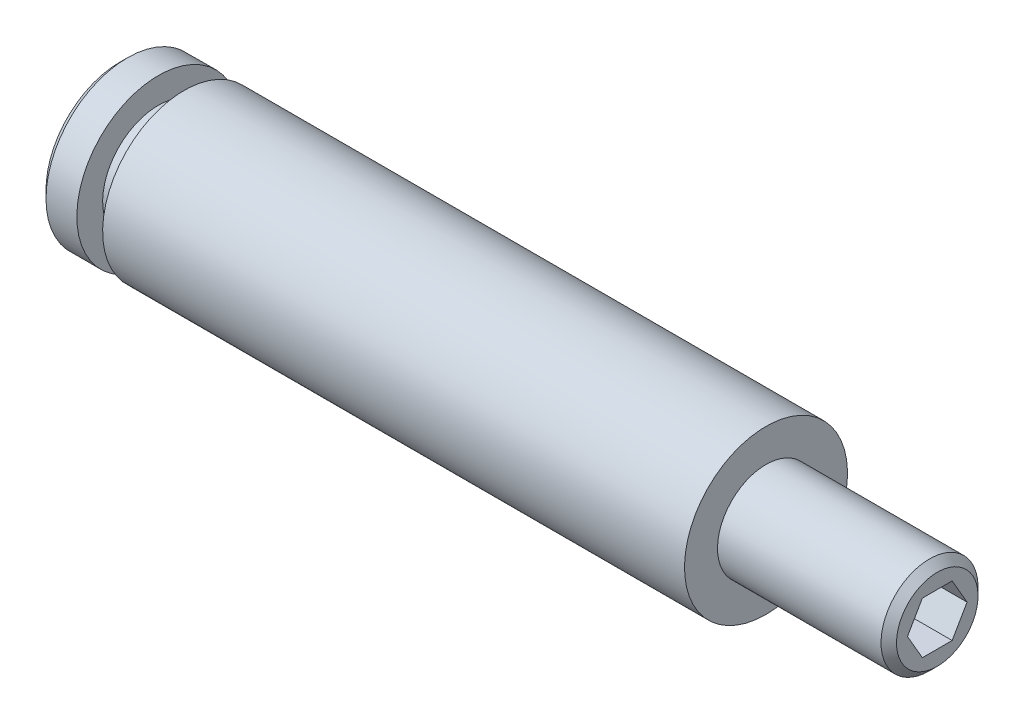
ISO-10303-21;
HEADER;
FILE_DESCRIPTION(('STEP AP214'),'2;1');
FILE_NAME('part.step','',(''),(''),'','','');
FILE_SCHEMA(('AUTOMOTIVE_DESIGN { 1 0 10303 214 1 1 1 1 }'));
ENDSEC;
DATA;
#1=APPLICATION_CONTEXT('core data for automotive mechanical design processes');
#2=APPLICATION_PROTOCOL_DEFINITION('international standard','automotive_design',2000,#1);
#3=PRODUCT_CONTEXT('',#1,'mechanical');
#4=PRODUCT('Part','Part','',(#3));
#5=PRODUCT_RELATED_PRODUCT_CATEGORY('part','',(#4));
#6=PRODUCT_DEFINITION_FORMATION('','',#4);
#7=PRODUCT_DEFINITION_CONTEXT('part definition',#1,'design');
#8=PRODUCT_DEFINITION('design','',#6,#7);
#9=PRODUCT_DEFINITION_SHAPE('','',#8);
#10=(LENGTH_UNIT() NAMED_UNIT(*) SI_UNIT(.MILLI.,.METRE.));
#11=(NAMED_UNIT(*) PLANE_ANGLE_UNIT() SI_UNIT($,.RADIAN.));
#12=(NAMED_UNIT(*) SI_UNIT($,.STERADIAN.) SOLID_ANGLE_UNIT());
#13=UNCERTAINTY_MEASURE_WITH_UNIT(LENGTH_MEASURE(1.E-05),#10,'distance_accuracy_value','');
#14=(GEOMETRIC_REPRESENTATION_CONTEXT(3) GLOBAL_UNCERTAINTY_ASSIGNED_CONTEXT((#13)) GLOBAL_UNIT_ASSIGNED_CONTEXT((#10,
#11,#12)) REPRESENTATION_CONTEXT('',''));
#15=CARTESIAN_POINT('',(0.,0.,0.));
#16=DIRECTION('',(0.,0.,1.));
#17=DIRECTION('',(1.,0.,0.));
#18=AXIS2_PLACEMENT_3D('',#15,#16,#17);
#19=CARTESIAN_POINT('',(0.,10.033,0.));
#20=DIRECTION('',(1.,0.,0.));
#21=DIRECTION('',(0.,1.,0.));
#22=AXIS2_PLACEMENT_3D('',#19,#20,#21);
#23=PLANE('',#22);
#24=CARTESIAN_POINT('',(0.,0.,0.));
#25=DIRECTION('',(1.,0.,0.));
#26=DIRECTION('',(0.,1.,0.));
#27=AXIS2_PLACEMENT_3D('',#24,#25,#26);
#28=CIRCLE('',#27,9.08050000000002);
#29=CARTESIAN_POINT('',(0.,9.08050000000002,0.));
#30=VERTEX_POINT('',#29);
#31=EDGE_CURVE('E194',#30,#30,#28,.F.);
#32=ORIENTED_EDGE('',*,*,#31,.T.);
#33=EDGE_LOOP('',(#32));
#34=FACE_BOUND('',#33,.T.);
#35=ADVANCED_FACE('F45',(#34),#23,.F.);
#36=CARTESIAN_POINT('',(100.6348,0.,0.));
#37=DIRECTION('',(-1.,0.,0.));
#38=DIRECTION('',(0.,-1.,0.));
#39=AXIS2_PLACEMENT_3D('',#36,#37,#38);
#40=PLANE('',#39);
#41=CARTESIAN_POINT('',(100.6348,0.,0.));
#42=DIRECTION('',(-1.,0.,0.));
#43=DIRECTION('',(0.,-1.,0.));
#44=AXIS2_PLACEMENT_3D('',#41,#42,#43);
#45=CIRCLE('',#44,5.01650000000002);
#46=CARTESIAN_POINT('',(100.6348,-5.01650000000003,0.));
#47=VERTEX_POINT('',#46);
#48=EDGE_CURVE('E11',#47,#47,#45,.F.);
#49=ORIENTED_EDGE('',*,*,#48,.T.);
#50=EDGE_LOOP('',(#49));
#51=FACE_BOUND('',#50,.T.);
#52=DIRECTION('',(0.,0.866025403784438,0.5));
#53=VECTOR('',#52,1.);
#54=CARTESIAN_POINT('',(100.6348,0.,-3.66617420935412));
#55=LINE('',#54,#53);
#56=CARTESIAN_POINT('',(100.6348,0.,-3.66617420935412));
#57=VERTEX_POINT('',#56);
#58=CARTESIAN_POINT('',(100.6348,3.175,-1.83308710467706));
#59=VERTEX_POINT('',#58);
#60=EDGE_CURVE('E142',#57,#59,#55,.T.);
#61=ORIENTED_EDGE('',*,*,#60,.F.);
#62=DIRECTION('',(0.,0.866025403784439,-0.5));
#63=VECTOR('',#62,1.);
#64=CARTESIAN_POINT('',(100.6348,-3.175,-1.83308710467706));
#65=LINE('',#64,#63);
#66=CARTESIAN_POINT('',(100.6348,-3.175,-1.83308710467706));
#67=VERTEX_POINT('',#66);
#68=EDGE_CURVE('E62',#67,#57,#65,.T.);
#69=ORIENTED_EDGE('',*,*,#68,.F.);
#70=DIRECTION('',(0.,0.,-1.));
#71=VECTOR('',#70,1.);
#72=CARTESIAN_POINT('',(100.6348,-3.175,1.83308710467706));
#73=LINE('',#72,#71);
#74=CARTESIAN_POINT('',(100.6348,-3.175,1.83308710467706));
#75=VERTEX_POINT('',#74);
#76=EDGE_CURVE('E155',#75,#67,#73,.T.);
#77=ORIENTED_EDGE('',*,*,#76,.F.);
#78=DIRECTION('',(0.,-0.866025403784438,-0.5));
#79=VECTOR('',#78,1.);
#80=CARTESIAN_POINT('',(100.6348,0.,3.66617420935412));
#81=LINE('',#80,#79);
#82=CARTESIAN_POINT('',(100.6348,0.,3.66617420935412));
#83=VERTEX_POINT('',#82);
#84=EDGE_CURVE('E152',#83,#75,#81,.T.);
#85=ORIENTED_EDGE('',*,*,#84,.F.);
#86=DIRECTION('',(0.,-0.866025403784438,0.5));
#87=VECTOR('',#86,1.);
#88=CARTESIAN_POINT('',(100.6348,3.175,1.83308710467706));
#89=LINE('',#88,#87);
#90=CARTESIAN_POINT('',(100.6348,3.175,1.83308710467706));
#91=VERTEX_POINT('',#90);
#92=EDGE_CURVE('E110',#91,#83,#89,.T.);
#93=ORIENTED_EDGE('',*,*,#92,.F.);
#94=DIRECTION('',(0.,0.,1.));
#95=VECTOR('',#94,1.);
#96=CARTESIAN_POINT('',(100.6348,3.175,-1.83308710467706));
#97=LINE('',#96,#95);
#98=EDGE_CURVE('E146',#59,#91,#97,.T.);
#99=ORIENTED_EDGE('',*,*,#98,.F.);
#100=EDGE_LOOP('',(#61,#69,#77,#85,#93,#99));
#101=FACE_BOUND('',#100,.T.);
#102=ADVANCED_FACE('F217',(#51,#101),#40,.F.);
#103=CARTESIAN_POINT('',(0.,0.,0.));
#104=DIRECTION('',(-1.,0.,0.));
#105=DIRECTION('',(0.,-1.,0.));
#106=AXIS2_PLACEMENT_3D('',#103,#104,#105);
#107=CYLINDRICAL_SURFACE('',#106,5.969);
#108=CARTESIAN_POINT('',(99.6823,0.,0.));
#109=DIRECTION('',(-1.,0.,0.));
#110=DIRECTION('',(0.,-1.,0.));
#111=AXIS2_PLACEMENT_3D('',#108,#109,#110);
#112=CIRCLE('',#111,5.969);
#113=CARTESIAN_POINT('',(99.6823,-5.96900000000001,0.));
#114=VERTEX_POINT('',#113);
#115=EDGE_CURVE('E55',#114,#114,#112,.T.);
#116=ORIENTED_EDGE('',*,*,#115,.T.);
#117=EDGE_LOOP('',(#116));
#118=FACE_BOUND('',#117,.T.);
#119=CARTESIAN_POINT('',(79.5528,0.,0.));
#120=DIRECTION('',(-1.,0.,0.));
#121=DIRECTION('',(0.,-1.,0.));
#122=AXIS2_PLACEMENT_3D('',#119,#120,#121);
#123=CIRCLE('',#122,5.969);
#124=CARTESIAN_POINT('',(79.5528,-5.969,0.));
#125=VERTEX_POINT('',#124);
#126=EDGE_CURVE('E190',#125,#125,#123,.T.);
#127=ORIENTED_EDGE('',*,*,#126,.F.);
#128=EDGE_LOOP('',(#127));
#129=FACE_BOUND('',#128,.T.);
#130=ADVANCED_FACE('F205',(#118,#129),#107,.T.);
#131=CARTESIAN_POINT('',(79.5528,5.969,0.));
#132=DIRECTION('',(-1.,0.,0.));
#133=DIRECTION('',(0.,-1.,0.));
#134=AXIS2_PLACEMENT_3D('',#131,#132,#133);
#135=PLANE('',#134);
#136=CARTESIAN_POINT('',(79.5528,0.,0.));
#137=DIRECTION('',(-1.,0.,0.));
#138=DIRECTION('',(0.,-1.,0.));
#139=AXIS2_PLACEMENT_3D('',#136,#137,#138);
#140=CIRCLE('',#139,10.033);
#141=CARTESIAN_POINT('',(79.5528,-10.033,0.));
#142=VERTEX_POINT('',#141);
#143=EDGE_CURVE('E186',#142,#142,#140,.T.);
#144=ORIENTED_EDGE('',*,*,#143,.F.);
#145=EDGE_LOOP('',(#144));
#146=FACE_BOUND('',#145,.T.);
#147=ORIENTED_EDGE('',*,*,#126,.T.);
#148=EDGE_LOOP('',(#147));
#149=FACE_BOUND('',#148,.T.);
#150=ADVANCED_FACE('F233',(#146,#149),#135,.F.);
#151=CARTESIAN_POINT('',(0.,0.,0.));
#152=DIRECTION('',(-1.,0.,0.));
#153=DIRECTION('',(0.,-1.,0.));
#154=AXIS2_PLACEMENT_3D('',#151,#152,#153);
#155=CYLINDRICAL_SURFACE('',#154,10.033);
#156=CARTESIAN_POINT('',(7.9248,0.,0.));
#157=DIRECTION('',(-1.,0.,0.));
#158=DIRECTION('',(0.,-1.,0.));
#159=AXIS2_PLACEMENT_3D('',#156,#157,#158);
#160=CIRCLE('',#159,10.033);
#161=CARTESIAN_POINT('',(7.9248,-10.033,0.));
#162=VERTEX_POINT('',#161);
#163=EDGE_CURVE('E182',#162,#162,#160,.T.);
#164=ORIENTED_EDGE('',*,*,#163,.F.);
#165=EDGE_LOOP('',(#164));
#166=FACE_BOUND('',#165,.T.);
#167=ORIENTED_EDGE('',*,*,#143,.T.);
#168=EDGE_LOOP('',(#167));
#169=FACE_BOUND('',#168,.T.);
#170=ADVANCED_FACE('F236',(#166,#169),#155,.T.);
#171=CARTESIAN_POINT('',(7.9248,10.033,0.));
#172=DIRECTION('',(1.,0.,0.));
#173=DIRECTION('',(0.,1.,0.));
#174=AXIS2_PLACEMENT_3D('',#171,#172,#173);
#175=PLANE('',#174);
#176=CARTESIAN_POINT('',(7.9248,0.,0.));
#177=DIRECTION('',(-1.,0.,0.));
#178=DIRECTION('',(0.,-1.,0.));
#179=AXIS2_PLACEMENT_3D('',#176,#177,#178);
#180=CIRCLE('',#179,6.85799999999999);
#181=CARTESIAN_POINT('',(7.9248,-6.85799999999999,0.));
#182=VERTEX_POINT('',#181);
#183=EDGE_CURVE('E178',#182,#182,#180,.T.);
#184=ORIENTED_EDGE('',*,*,#183,.F.);
#185=EDGE_LOOP('',(#184));
#186=FACE_BOUND('',#185,.T.);
#187=ORIENTED_EDGE('',*,*,#163,.T.);
#188=EDGE_LOOP('',(#187));
#189=FACE_BOUND('',#188,.T.);
#190=ADVANCED_FACE('F240',(#186,#189),#175,.F.);
#191=CARTESIAN_POINT('',(0.,0.,0.));
#192=DIRECTION('',(-1.,0.,0.));
#193=DIRECTION('',(0.,-1.,0.));
#194=AXIS2_PLACEMENT_3D('',#191,#192,#193);
#195=CYLINDRICAL_SURFACE('',#194,6.85799999999999);
#196=CARTESIAN_POINT('',(4.7498,0.,0.));
#197=DIRECTION('',(-1.,0.,0.));
#198=DIRECTION('',(0.,-1.,0.));
#199=AXIS2_PLACEMENT_3D('',#196,#197,#198);
#200=CIRCLE('',#199,6.85799999999999);
#201=CARTESIAN_POINT('',(4.7498,-6.85799999999999,0.));
#202=VERTEX_POINT('',#201);
#203=EDGE_CURVE('E174',#202,#202,#200,.T.);
#204=ORIENTED_EDGE('',*,*,#203,.F.);
#205=EDGE_LOOP('',(#204));
#206=FACE_BOUND('',#205,.T.);
#207=ORIENTED_EDGE('',*,*,#183,.T.);
#208=EDGE_LOOP('',(#207));
#209=FACE_BOUND('',#208,.T.);
#210=ADVANCED_FACE('F244',(#206,#209),#195,.T.);
#211=CARTESIAN_POINT('',(4.7498,6.85799999999999,0.));
#212=DIRECTION('',(-1.,0.,0.));
#213=DIRECTION('',(0.,-1.,0.));
#214=AXIS2_PLACEMENT_3D('',#211,#212,#213);
#215=PLANE('',#214);
#216=CARTESIAN_POINT('',(4.7498,0.,0.));
#217=DIRECTION('',(-1.,0.,0.));
#218=DIRECTION('',(0.,-1.,0.));
#219=AXIS2_PLACEMENT_3D('',#216,#217,#218);
#220=CIRCLE('',#219,10.033);
#221=CARTESIAN_POINT('',(4.7498,-10.033,0.));
#222=VERTEX_POINT('',#221);
#223=EDGE_CURVE('E161',#222,#222,#220,.T.);
#224=ORIENTED_EDGE('',*,*,#223,.F.);
#225=EDGE_LOOP('',(#224));
#226=FACE_BOUND('',#225,.T.);
#227=ORIENTED_EDGE('',*,*,#203,.T.);
#228=EDGE_LOOP('',(#227));
#229=FACE_BOUND('',#228,.T.);
#230=ADVANCED_FACE('F248',(#226,#229),#215,.F.);
#231=CARTESIAN_POINT('',(0.,0.,0.));
#232=DIRECTION('',(-1.,0.,0.));
#233=DIRECTION('',(0.,-1.,0.));
#234=AXIS2_PLACEMENT_3D('',#231,#232,#233);
#235=CYLINDRICAL_SURFACE('',#234,10.033);
#236=CARTESIAN_POINT('',(0.952499999999978,0.,0.));
#237=DIRECTION('',(1.,0.,0.));
#238=DIRECTION('',(0.,1.,0.));
#239=AXIS2_PLACEMENT_3D('',#236,#237,#238);
#240=CIRCLE('',#239,10.033);
#241=CARTESIAN_POINT('',(0.952499999999978,10.033,0.));
#242=VERTEX_POINT('',#241);
#243=EDGE_CURVE('E198',#242,#242,#240,.T.);
#244=ORIENTED_EDGE('',*,*,#243,.T.);
#245=EDGE_LOOP('',(#244));
#246=FACE_BOUND('',#245,.T.);
#247=ORIENTED_EDGE('',*,*,#223,.T.);
#248=EDGE_LOOP('',(#247));
#249=FACE_BOUND('',#248,.T.);
#250=ADVANCED_FACE('F252',(#246,#249),#235,.T.);
#251=CARTESIAN_POINT('',(91.1098,-3.175,-1.83308710467706));
#252=DIRECTION('',(0.,-0.5,-0.866025403784439));
#253=DIRECTION('',(0.,0.866025403784439,-0.5));
#254=AXIS2_PLACEMENT_3D('',#251,#252,#253);
#255=PLANE('',#254);
#256=ORIENTED_EDGE('',*,*,#68,.T.);
#257=DIRECTION('',(1.,0.,0.));
#258=VECTOR('',#257,1.);
#259=CARTESIAN_POINT('',(91.1098,0.,-3.66617420935412));
#260=LINE('',#259,#258);
#261=CARTESIAN_POINT('',(91.1098,0.,-3.66617420935412));
#262=VERTEX_POINT('',#261);
#263=EDGE_CURVE('E92',#262,#57,#260,.T.);
#264=ORIENTED_EDGE('',*,*,#263,.F.);
#265=DIRECTION('',(0.,0.866025403784439,-0.5));
#266=VECTOR('',#265,1.);
#267=CARTESIAN_POINT('',(91.1098,-3.175,-1.83308710467706));
#268=LINE('',#267,#266);
#269=CARTESIAN_POINT('',(91.1098,-3.175,-1.83308710467706));
#270=VERTEX_POINT('',#269);
#271=EDGE_CURVE('E158',#270,#262,#268,.T.);
#272=ORIENTED_EDGE('',*,*,#271,.F.);
#273=DIRECTION('',(1.,0.,0.));
#274=VECTOR('',#273,1.);
#275=CARTESIAN_POINT('',(91.1098,-3.175,-1.83308710467706));
#276=LINE('',#275,#274);
#277=EDGE_CURVE('E70',#270,#67,#276,.T.);
#278=ORIENTED_EDGE('',*,*,#277,.T.);
#279=EDGE_LOOP('',(#256,#264,#272,#278));
#280=FACE_BOUND('',#279,.T.);
#281=ADVANCED_FACE('F256',(#280),#255,.F.);
#282=CARTESIAN_POINT('',(91.1098,-3.175,1.83308710467706));
#283=DIRECTION('',(0.,-1.,0.));
#284=DIRECTION('',(0.,0.,-1.));
#285=AXIS2_PLACEMENT_3D('',#282,#283,#284);
#286=PLANE('',#285);
#287=ORIENTED_EDGE('',*,*,#76,.T.);
#288=ORIENTED_EDGE('',*,*,#277,.F.);
#289=DIRECTION('',(0.,0.,-1.));
#290=VECTOR('',#289,1.);
#291=CARTESIAN_POINT('',(91.1098,-3.175,1.83308710467706));
#292=LINE('',#291,#290);
#293=CARTESIAN_POINT('',(91.1098,-3.175,1.83308710467706));
#294=VERTEX_POINT('',#293);
#295=EDGE_CURVE('E124',#294,#270,#292,.T.);
#296=ORIENTED_EDGE('',*,*,#295,.F.);
#297=DIRECTION('',(1.,0.,0.));
#298=VECTOR('',#297,1.);
#299=CARTESIAN_POINT('',(91.1098,-3.175,1.83308710467706));
#300=LINE('',#299,#298);
#301=EDGE_CURVE('E115',#294,#75,#300,.T.);
#302=ORIENTED_EDGE('',*,*,#301,.T.);
#303=EDGE_LOOP('',(#287,#288,#296,#302));
#304=FACE_BOUND('',#303,.T.);
#305=ADVANCED_FACE('F260',(#304),#286,.F.);
#306=CARTESIAN_POINT('',(91.1098,0.,3.66617420935412));
#307=DIRECTION('',(0.,-0.5,0.866025403784438));
#308=DIRECTION('',(0.,-0.866025403784438,-0.5));
#309=AXIS2_PLACEMENT_3D('',#306,#307,#308);
#310=PLANE('',#309);
#311=ORIENTED_EDGE('',*,*,#84,.T.);
#312=ORIENTED_EDGE('',*,*,#301,.F.);
#313=DIRECTION('',(0.,-0.866025403784438,-0.5));
#314=VECTOR('',#313,1.);
#315=CARTESIAN_POINT('',(91.1098,0.,3.66617420935412));
#316=LINE('',#315,#314);
#317=CARTESIAN_POINT('',(91.1098,0.,3.66617420935412));
#318=VERTEX_POINT('',#317);
#319=EDGE_CURVE('E119',#318,#294,#316,.T.);
#320=ORIENTED_EDGE('',*,*,#319,.F.);
#321=DIRECTION('',(1.,0.,0.));
#322=VECTOR('',#321,1.);
#323=CARTESIAN_POINT('',(91.1098,0.,3.66617420935412));
#324=LINE('',#323,#322);
#325=EDGE_CURVE('E103',#318,#83,#324,.T.);
#326=ORIENTED_EDGE('',*,*,#325,.T.);
#327=EDGE_LOOP('',(#311,#312,#320,#326));
#328=FACE_BOUND('',#327,.T.);
#329=ADVANCED_FACE('F120',(#328),#310,.F.);
#330=CARTESIAN_POINT('',(91.1098,3.175,1.83308710467706));
#331=DIRECTION('',(0.,0.5,0.866025403784438));
#332=DIRECTION('',(0.,-0.866025403784439,0.5));
#333=AXIS2_PLACEMENT_3D('',#330,#331,#332);
#334=PLANE('',#333);
#335=ORIENTED_EDGE('',*,*,#92,.T.);
#336=ORIENTED_EDGE('',*,*,#325,.F.);
#337=DIRECTION('',(0.,-0.866025403784438,0.5));
#338=VECTOR('',#337,1.);
#339=CARTESIAN_POINT('',(91.1098,3.175,1.83308710467706));
#340=LINE('',#339,#338);
#341=CARTESIAN_POINT('',(91.1098,3.175,1.83308710467706));
#342=VERTEX_POINT('',#341);
#343=EDGE_CURVE('E107',#342,#318,#340,.T.);
#344=ORIENTED_EDGE('',*,*,#343,.F.);
#345=DIRECTION('',(1.,0.,0.));
#346=VECTOR('',#345,1.);
#347=CARTESIAN_POINT('',(91.1098,3.175,1.83308710467706));
#348=LINE('',#347,#346);
#349=EDGE_CURVE('E116',#342,#91,#348,.T.);
#350=ORIENTED_EDGE('',*,*,#349,.T.);
#351=EDGE_LOOP('',(#335,#336,#344,#350));
#352=FACE_BOUND('',#351,.T.);
#353=ADVANCED_FACE('F105',(#352),#334,.F.);
#354=CARTESIAN_POINT('',(91.1098,3.175,-1.83308710467706));
#355=DIRECTION('',(0.,1.,0.));
#356=DIRECTION('',(-1.,0.,0.));
#357=AXIS2_PLACEMENT_3D('',#354,#355,#356);
#358=PLANE('',#357);
#359=ORIENTED_EDGE('',*,*,#98,.T.);
#360=ORIENTED_EDGE('',*,*,#349,.F.);
#361=DIRECTION('',(0.,0.,1.));
#362=VECTOR('',#361,1.);
#363=CARTESIAN_POINT('',(91.1098,3.175,-1.83308710467706));
#364=LINE('',#363,#362);
#365=CARTESIAN_POINT('',(91.1098,3.175,-1.83308710467706));
#366=VERTEX_POINT('',#365);
#367=EDGE_CURVE('E130',#366,#342,#364,.T.);
#368=ORIENTED_EDGE('',*,*,#367,.F.);
#369=DIRECTION('',(1.,0.,0.));
#370=VECTOR('',#369,1.);
#371=CARTESIAN_POINT('',(91.1098,3.175,-1.83308710467706));
#372=LINE('',#371,#370);
#373=EDGE_CURVE('E166',#366,#59,#372,.T.);
#374=ORIENTED_EDGE('',*,*,#373,.T.);
#375=EDGE_LOOP('',(#359,#360,#368,#374));
#376=FACE_BOUND('',#375,.T.);
#377=ADVANCED_FACE('F264',(#376),#358,.F.);
#378=CARTESIAN_POINT('',(91.1098,0.,-3.66617420935412));
#379=DIRECTION('',(0.,0.5,-0.866025403784438));
#380=DIRECTION('',(0.,0.866025403784438,0.5));
#381=AXIS2_PLACEMENT_3D('',#378,#379,#380);
#382=PLANE('',#381);
#383=ORIENTED_EDGE('',*,*,#60,.T.);
#384=ORIENTED_EDGE('',*,*,#373,.F.);
#385=DIRECTION('',(0.,0.866025403784438,0.5));
#386=VECTOR('',#385,1.);
#387=CARTESIAN_POINT('',(91.1098,0.,-3.66617420935412));
#388=LINE('',#387,#386);
#389=EDGE_CURVE('E134',#262,#366,#388,.T.);
#390=ORIENTED_EDGE('',*,*,#389,.F.);
#391=ORIENTED_EDGE('',*,*,#263,.T.);
#392=EDGE_LOOP('',(#383,#384,#390,#391));
#393=FACE_BOUND('',#392,.T.);
#394=ADVANCED_FACE('F261',(#393),#382,.F.);
#395=CARTESIAN_POINT('',(91.1098,0.,0.));
#396=DIRECTION('',(1.,0.,0.));
#397=DIRECTION('',(0.,0.,-1.));
#398=AXIS2_PLACEMENT_3D('',#395,#396,#397);
#399=PLANE('',#398);
#400=ORIENTED_EDGE('',*,*,#271,.T.);
#401=ORIENTED_EDGE('',*,*,#389,.T.);
#402=ORIENTED_EDGE('',*,*,#367,.T.);
#403=ORIENTED_EDGE('',*,*,#343,.T.);
#404=ORIENTED_EDGE('',*,*,#319,.T.);
#405=ORIENTED_EDGE('',*,*,#295,.T.);
#406=EDGE_LOOP('',(#400,#401,#402,#403,#404,#405));
#407=FACE_BOUND('',#406,.T.);
#408=ADVANCED_FACE('F127',(#407),#399,.T.);
#409=CARTESIAN_POINT('',(0.,0.,0.));
#410=DIRECTION('',(1.,0.,0.));
#411=DIRECTION('',(0.,1.,0.));
#412=AXIS2_PLACEMENT_3D('',#409,#410,#411);
#413=CONICAL_SURFACE('',#412,9.08050000000002,0.78539816339745);
#414=ORIENTED_EDGE('',*,*,#243,.F.);
#415=EDGE_LOOP('',(#414));
#416=FACE_BOUND('',#415,.T.);
#417=ORIENTED_EDGE('',*,*,#31,.F.);
#418=EDGE_LOOP('',(#417));
#419=FACE_BOUND('',#418,.T.);
#420=ADVANCED_FACE('F209',(#416,#419),#413,.T.);
#421=CARTESIAN_POINT('',(99.6823,0.,0.));
#422=DIRECTION('',(-1.,0.,0.));
#423=DIRECTION('',(0.,-1.,0.));
#424=AXIS2_PLACEMENT_3D('',#421,#422,#423);
#425=CONICAL_SURFACE('',#424,5.969,0.785398163397447);
#426=CARTESIAN_POINT('',(100.6348,-5.01650000000003,0.));
#427=CARTESIAN_POINT('',(100.624878125,-5.02642187500003,0.));
#428=CARTESIAN_POINT('',(100.61495625,-5.03634375000003,0.));
#429=CARTESIAN_POINT('',(100.5951125,-5.05618750000003,0.));
#430=CARTESIAN_POINT('',(100.585190625,-5.06610937500003,0.));
#431=CARTESIAN_POINT('',(100.565346875,-5.08595312500003,0.));
#432=CARTESIAN_POINT('',(100.555425,-5.09587500000003,0.));
#433=CARTESIAN_POINT('',(100.53558125,-5.11571875000003,0.));
#434=CARTESIAN_POINT('',(100.525659375,-5.12564062500003,0.));
#435=CARTESIAN_POINT('',(100.505815625,-5.14548437500003,0.));
#436=CARTESIAN_POINT('',(100.49589375,-5.15540625000002,0.));
#437=CARTESIAN_POINT('',(100.47605,-5.17525000000002,0.));
#438=CARTESIAN_POINT('',(100.466128125,-5.18517187500002,0.));
#439=CARTESIAN_POINT('',(100.446284375,-5.20501562500002,0.));
#440=CARTESIAN_POINT('',(100.4363625,-5.21493750000002,0.));
#441=CARTESIAN_POINT('',(100.41651875,-5.23478125000002,0.));
#442=CARTESIAN_POINT('',(100.406596875,-5.24470312500002,0.));
#443=CARTESIAN_POINT('',(100.386753125,-5.26454687500002,0.));
#444=CARTESIAN_POINT('',(100.37683125,-5.27446875000002,0.));
#445=CARTESIAN_POINT('',(100.3569875,-5.29431250000002,0.));
#446=CARTESIAN_POINT('',(100.347065625,-5.30423437500002,0.));
#447=CARTESIAN_POINT('',(100.327221875,-5.32407812500002,0.));
#448=CARTESIAN_POINT('',(100.3173,-5.33400000000002,0.));
#449=CARTESIAN_POINT('',(100.29745625,-5.35384375000002,0.));
#450=CARTESIAN_POINT('',(100.287534375,-5.36376562500002,0.));
#451=CARTESIAN_POINT('',(100.267690625,-5.38360937500002,0.));
#452=CARTESIAN_POINT('',(100.25776875,-5.39353125000002,0.));
#453=CARTESIAN_POINT('',(100.237925,-5.41337500000002,0.));
#454=CARTESIAN_POINT('',(100.228003125,-5.42329687500002,0.));
#455=CARTESIAN_POINT('',(100.208159375,-5.44314062500002,0.));
#456=CARTESIAN_POINT('',(100.1982375,-5.45306250000002,0.));
#457=CARTESIAN_POINT('',(100.17839375,-5.47290625000002,0.));
#458=CARTESIAN_POINT('',(100.168471875,-5.48282812500002,0.));
#459=CARTESIAN_POINT('',(100.148628125,-5.50267187500002,0.));
#460=CARTESIAN_POINT('',(100.13870625,-5.51259375000002,0.));
#461=CARTESIAN_POINT('',(100.1188625,-5.53243750000002,0.));
#462=CARTESIAN_POINT('',(100.108940625,-5.54235937500002,0.));
#463=CARTESIAN_POINT('',(100.089096875,-5.56220312500002,0.));
#464=CARTESIAN_POINT('',(100.079175,-5.57212500000002,0.));
#465=CARTESIAN_POINT('',(100.05933125,-5.59196875000002,0.));
#466=CARTESIAN_POINT('',(100.049409375,-5.60189062500001,0.));
#467=CARTESIAN_POINT('',(100.029565625,-5.62173437500001,0.));
#468=CARTESIAN_POINT('',(100.01964375,-5.63165625000001,0.));
#469=CARTESIAN_POINT('',(99.9998,-5.65150000000001,0.));
#470=CARTESIAN_POINT('',(99.989878125,-5.66142187500001,0.));
#471=CARTESIAN_POINT('',(99.970034375,-5.68126562500001,0.));
#472=CARTESIAN_POINT('',(99.9601125,-5.69118750000001,0.));
#473=CARTESIAN_POINT('',(99.94026875,-5.71103125000001,0.));
#474=CARTESIAN_POINT('',(99.930346875,-5.72095312500001,0.));
#475=CARTESIAN_POINT('',(99.910503125,-5.74079687500001,0.));
#476=CARTESIAN_POINT('',(99.90058125,-5.75071875000001,0.));
#477=CARTESIAN_POINT('',(99.8807375,-5.77056250000001,0.));
#478=CARTESIAN_POINT('',(99.870815625,-5.78048437500001,0.));
#479=CARTESIAN_POINT('',(99.850971875,-5.80032812500001,0.));
#480=CARTESIAN_POINT('',(99.84105,-5.81025000000001,0.));
#481=CARTESIAN_POINT('',(99.82120625,-5.83009375000001,0.));
#482=CARTESIAN_POINT('',(99.811284375,-5.84001562500001,0.));
#483=CARTESIAN_POINT('',(99.791440625,-5.85985937500001,0.));
#484=CARTESIAN_POINT('',(99.78151875,-5.86978125000001,0.));
#485=CARTESIAN_POINT('',(99.761675,-5.88962500000001,0.));
#486=CARTESIAN_POINT('',(99.751753125,-5.89954687500001,0.));
#487=CARTESIAN_POINT('',(99.731909375,-5.91939062500001,0.));
#488=CARTESIAN_POINT('',(99.7219875,-5.92931250000001,0.));
#489=CARTESIAN_POINT('',(99.70214375,-5.94915625000001,0.));
#490=CARTESIAN_POINT('',(99.692221875,-5.95907812500001,0.));
#491=CARTESIAN_POINT('',(99.6823,-5.96900000000001,0.));
#492=B_SPLINE_CURVE_WITH_KNOTS('',3,(#426,#427,#428,#429,#430,#431,#432,#433,#434,#435,#436,
#437,#438,#439,#440,#441,#442,#443,#444,#445,#446,#447,#448,#449,#450,#451,#452,#453,#454,#455,
#456,#457,#458,#459,#460,#461,#462,#463,#464,#465,#466,#467,#468,#469,#470,#471,#472,#473,#474,
#475,#476,#477,#478,#479,#480,#481,#482,#483,#484,#485,#486,#487,#488,#489,#490,#491),
.UNSPECIFIED.,.F.,.F.,(4,2,2,2,2,2,2,2,2,2,2,2,2,2,2,2,2,2,2,2,2,2,2,2,2,2,2,2,2,2,2,2,4),(0.,
0.042094950567509,0.0841899011350186,0.126284851702528,0.168379802270037,0.210474752837546,
0.252569703405055,0.294664653972575,0.336759604540084,0.378854555107593,0.420949505675102,
0.463044456242611,0.505139406810121,0.547234357377639,0.589329307945149,0.631424258512658,
0.673519209080167,0.715614159647676,0.757709110215185,0.799804060782695,0.841899011350214,
0.883993961917723,0.926088912485232,0.968183863052741,1.01027881362025,1.05237376418776,
1.09446871475528,1.13656366532279,1.1786586158903,1.22075356645781,1.26284851702532,
1.30494346759283,1.34703841816033),.UNSPECIFIED.);
#493=EDGE_CURVE('BSEAM48',#47,#114,#492,.T.);
#494=ORIENTED_EDGE('',*,*,#48,.F.);
#495=ORIENTED_EDGE('',*,*,#115,.F.);
#496=ORIENTED_EDGE('',*,*,#493,.T.);
#497=ORIENTED_EDGE('',*,*,#493,.F.);
#498=EDGE_LOOP('',(#494,#496,#495,#497));
#499=FACE_BOUND('',#498,.T.);
#500=ADVANCED_FACE('F48',(#499),#425,.T.);
#501=CLOSED_SHELL('',(#35,#102,#130,#150,#170,#190,#210,#230,#250,#281,#305,#329,#353,#377,#394,
#408,#420,#500));
#502=MANIFOLD_SOLID_BREP('B2',#501);
#503=ADVANCED_BREP_SHAPE_REPRESENTATION('',(#18,#502),#14);
#504=SHAPE_DEFINITION_REPRESENTATION(#9,#503);
ENDSEC;
END-ISO-10303-21;
